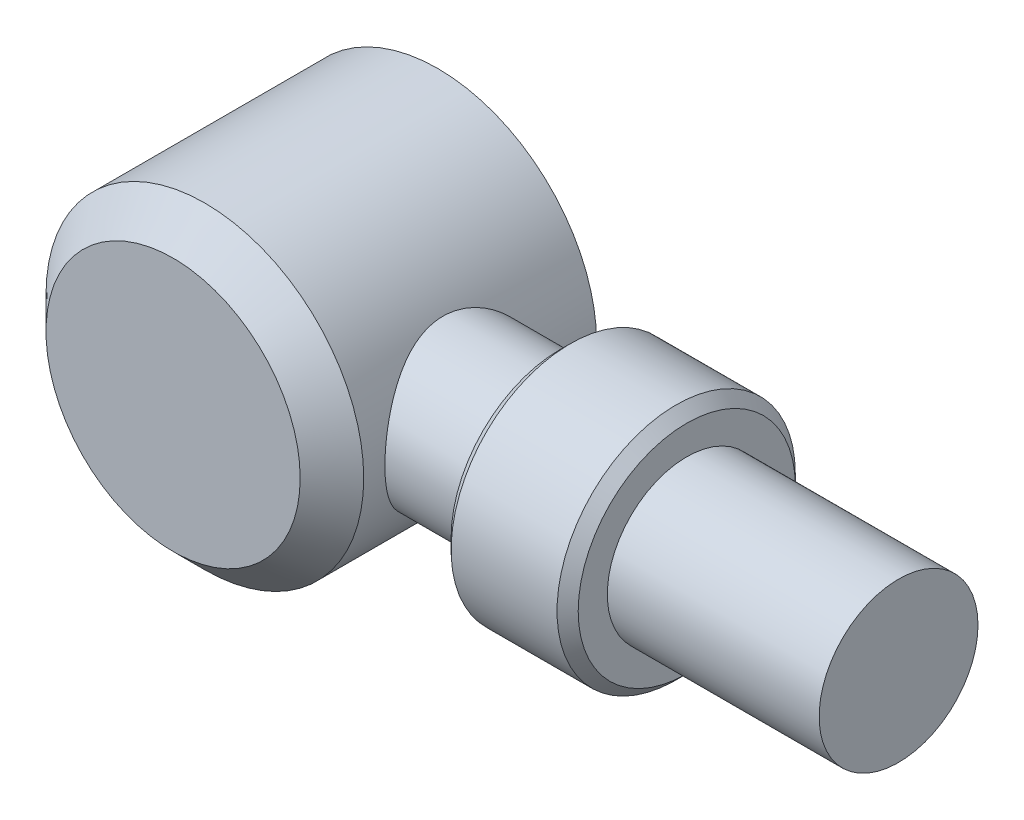
ISO-10303-21;
HEADER;
FILE_DESCRIPTION(('STEP AP214'),'2;1');
FILE_NAME('part.step','',(''),(''),'','','');
FILE_SCHEMA(('AUTOMOTIVE_DESIGN { 1 0 10303 214 1 1 1 1 }'));
ENDSEC;
DATA;
#1=APPLICATION_CONTEXT('core data for automotive mechanical design processes');
#2=APPLICATION_PROTOCOL_DEFINITION('international standard','automotive_design',2000,#1);
#3=PRODUCT_CONTEXT('',#1,'mechanical');
#4=PRODUCT('Part','Part','',(#3));
#5=PRODUCT_RELATED_PRODUCT_CATEGORY('part','',(#4));
#6=PRODUCT_DEFINITION_FORMATION('','',#4);
#7=PRODUCT_DEFINITION_CONTEXT('part definition',#1,'design');
#8=PRODUCT_DEFINITION('design','',#6,#7);
#9=PRODUCT_DEFINITION_SHAPE('','',#8);
#10=(LENGTH_UNIT() NAMED_UNIT(*) SI_UNIT(.MILLI.,.METRE.));
#11=(NAMED_UNIT(*) PLANE_ANGLE_UNIT() SI_UNIT($,.RADIAN.));
#12=(NAMED_UNIT(*) SI_UNIT($,.STERADIAN.) SOLID_ANGLE_UNIT());
#13=UNCERTAINTY_MEASURE_WITH_UNIT(LENGTH_MEASURE(1.E-05),#10,'distance_accuracy_value','');
#14=(GEOMETRIC_REPRESENTATION_CONTEXT(3) GLOBAL_UNCERTAINTY_ASSIGNED_CONTEXT((#13)) GLOBAL_UNIT_ASSIGNED_CONTEXT((#10,
#11,#12)) REPRESENTATION_CONTEXT('',''));
#15=CARTESIAN_POINT('',(0.,0.,0.));
#16=DIRECTION('',(0.,0.,1.));
#17=DIRECTION('',(1.,0.,0.));
#18=AXIS2_PLACEMENT_3D('',#15,#16,#17);
#19=CARTESIAN_POINT('',(-30.002,0.,0.));
#20=DIRECTION('',(1.,0.,0.));
#21=DIRECTION('',(0.,0.,-1.));
#22=AXIS2_PLACEMENT_3D('',#19,#20,#21);
#23=CYLINDRICAL_SURFACE('',#22,15.);
#24=CARTESIAN_POINT('',(30.,0.,-15.));
#25=CARTESIAN_POINT('',(29.999998801557,0.394466621474774,-14.9999986967893));
#26=CARTESIAN_POINT('',(29.9922016255587,0.788960822893599,-14.9844217290986));
#27=CARTESIAN_POINT('',(29.9612093031255,1.57504384672489,-14.9222912626951));
#28=CARTESIAN_POINT('',(29.9380074580889,1.96663133023565,-14.8757242881962));
#29=CARTESIAN_POINT('',(29.8767543344875,2.74444839066597,-14.752062134402));
#30=CARTESIAN_POINT('',(29.8386781124095,3.13066783309048,-14.674915671778));
#31=CARTESIAN_POINT('',(29.7486545172118,3.89427274204148,-14.4909926788045));
#32=CARTESIAN_POINT('',(29.6967085313725,4.27165908796738,-14.3842191117729));
#33=CARTESIAN_POINT('',(29.5804545351662,5.01370255233915,-14.1426464967422));
#34=CARTESIAN_POINT('',(29.5161956713169,5.37840368544458,-14.0079586988167));
#35=CARTESIAN_POINT('',(29.3766988124944,6.09447648128182,-13.7115835174738));
#36=CARTESIAN_POINT('',(29.3014605811394,6.4458478568234,-13.5498955527415));
#37=CARTESIAN_POINT('',(29.1417386091232,7.1332709828304,-13.2009461452605));
#38=CARTESIAN_POINT('',(29.0572582848678,7.4693283295993,-13.0136941461368));
#39=CARTESIAN_POINT('',(28.8808404069853,8.12479620523716,-12.6148696065897));
#40=CARTESIAN_POINT('',(28.7888999175694,8.44420009848105,-12.4032874777652));
#41=CARTESIAN_POINT('',(28.5938305145778,9.08356730455507,-11.9437431549207));
#42=CARTESIAN_POINT('',(28.4903612440417,9.40240338911198,-11.6943566948693));
#43=CARTESIAN_POINT('',(28.279698941058,10.0182110858624,-11.1713323045257));
#44=CARTESIAN_POINT('',(28.172505695949,10.3151814463611,-10.8976929878613));
#45=CARTESIAN_POINT('',(27.9568659465954,10.8860835918351,-10.32744213221));
#46=CARTESIAN_POINT('',(27.8484187026569,11.1600008976787,-10.0308163772597));
#47=CARTESIAN_POINT('',(27.6329515274257,11.6833254232374,-9.41609706949253));
#48=CARTESIAN_POINT('',(27.5259318676454,11.9327280363632,-9.09799950074794));
#49=CARTESIAN_POINT('',(27.3078803121426,12.424066666325,-8.41621019135653));
#50=CARTESIAN_POINT('',(27.1971850469137,12.6639084928374,-8.05089693128161));
#51=CARTESIAN_POINT('',(26.98418857013,13.1116371457317,-7.29906225682783));
#52=CARTESIAN_POINT('',(26.8818838099586,13.319537514021,-6.91254992484985));
#53=CARTESIAN_POINT('',(26.6891822439467,13.7015816677248,-6.12045119528937));
#54=CARTESIAN_POINT('',(26.5987818363898,13.8757356708103,-5.71487061752194));
#55=CARTESIAN_POINT('',(26.4333149346089,14.1884178363296,-4.88717106989482));
#56=CARTESIAN_POINT('',(26.3582467414714,14.3269499463523,-4.46505393858207));
#57=CARTESIAN_POINT('',(26.2305343638818,14.5593818816456,-3.63312743966091));
#58=CARTESIAN_POINT('',(26.1768180083281,14.6554546162323,-3.22409061692207));
#59=CARTESIAN_POINT('',(26.0879066274182,14.8131483158836,-2.39742530260421));
#60=CARTESIAN_POINT('',(26.0527108097854,14.874770754679,-1.97979717934039));
#61=CARTESIAN_POINT('',(26.0023849794443,14.9625716596024,-1.13997809784131));
#62=CARTESIAN_POINT('',(25.9872379945846,14.9887801055065,-0.717791304375868));
#63=CARTESIAN_POINT('',(25.9776389850629,15.0054120092055,0.127503752153189));
#64=CARTESIAN_POINT('',(25.9831849859217,14.9958388811994,0.550611923450824));
#65=CARTESIAN_POINT('',(26.0128145300121,14.9443693637688,1.34318604493255));
#66=CARTESIAN_POINT('',(26.0345983573782,14.9064815133301,1.71300749674339));
#67=CARTESIAN_POINT('',(26.0932327004698,14.8036048078167,2.44761394651885));
#68=CARTESIAN_POINT('',(26.1300818023065,14.7386184959446,2.81239941379462));
#69=CARTESIAN_POINT('',(26.2176501225825,14.5822778462236,3.53465011425935));
#70=CARTESIAN_POINT('',(26.2683728157028,14.490916902454,3.8921134894694));
#71=CARTESIAN_POINT('',(26.3821200845655,14.2827793732036,4.5975509702241));
#72=CARTESIAN_POINT('',(26.4451453155715,14.1660014339124,4.94552456919407));
#73=CARTESIAN_POINT('',(26.5832643427316,13.9051185945145,5.63806138553528));
#74=CARTESIAN_POINT('',(26.6586025203762,13.7604466030275,5.98236177926318));
#75=CARTESIAN_POINT('',(26.8182136501968,13.4467240006948,6.65764881287025));
#76=CARTESIAN_POINT('',(26.902489795027,13.2776646708395,6.98863063670926));
#77=CARTESIAN_POINT('',(27.0778318787809,12.9163207460711,7.63583954119816));
#78=CARTESIAN_POINT('',(27.1688988831368,12.7240325037789,7.95206429387364));
#79=CARTESIAN_POINT('',(27.3556808628563,12.3173373374606,8.56852275615356));
#80=CARTESIAN_POINT('',(27.4513962107378,12.1029286391493,8.86875518007756));
#81=CARTESIAN_POINT('',(27.6577118454254,11.6244221009995,9.48921356105551));
#82=CARTESIAN_POINT('',(27.7686577108201,11.357472454083,9.8071301881341));
#83=CARTESIAN_POINT('',(27.9908280513488,10.7983337273758,10.4195910602954));
#84=CARTESIAN_POINT('',(28.1020524162508,10.5061534517949,10.7141433900476));
#85=CARTESIAN_POINT('',(28.3221096552122,9.89761910582899,11.2787205781467));
#86=CARTESIAN_POINT('',(28.4309403363792,9.58124396820907,11.5487236024523));
#87=CARTESIAN_POINT('',(28.6433515457476,8.92619254193718,12.0621805278786));
#88=CARTESIAN_POINT('',(28.7469341587371,8.58752523371367,12.3056450163623));
#89=CARTESIAN_POINT('',(28.9509720492018,7.87309152384947,12.7751937974681));
#90=CARTESIAN_POINT('',(29.0510540383704,7.49633062281164,12.999931268877));
#91=CARTESIAN_POINT('',(29.2398602306793,6.72229496746224,13.4165538554255));
#92=CARTESIAN_POINT('',(29.3285839048568,6.32501925897373,13.608437440683));
#93=CARTESIAN_POINT('',(29.4920238478019,5.51289034160744,13.9571914545699));
#94=CARTESIAN_POINT('',(29.5667490178724,5.09804850978522,14.1140841452216));
#95=CARTESIAN_POINT('',(29.6999715301343,4.25373396764103,14.391076168471));
#96=CARTESIAN_POINT('',(29.7584707390643,3.82426294674312,14.5111797336915));
#97=CARTESIAN_POINT('',(29.8532869753576,2.99040123124788,14.7045987917793));
#98=CARTESIAN_POINT('',(29.8910400620817,2.58687987737182,14.780965864728));
#99=CARTESIAN_POINT('',(29.9502903820135,1.77375891598893,14.9004227368483));
#100=CARTESIAN_POINT('',(29.9717884994209,1.36415964033065,14.9435143460633));
#101=CARTESIAN_POINT('',(29.997911413823,0.542432179601609,14.9958394822899));
#102=CARTESIAN_POINT('',(30.0025429572167,0.130305071717025,15.0050865466642));
#103=CARTESIAN_POINT('',(29.994817097575,-0.693142933067787,14.9896332143828));
#104=CARTESIAN_POINT('',(29.9824604464011,-1.10446386484085,14.9649343201033));
#105=CARTESIAN_POINT('',(29.9427257003129,-1.89104365716467,14.8851569218173));
#106=CARTESIAN_POINT('',(29.9165882159642,-2.26662317638415,14.8325856924447));
#107=CARTESIAN_POINT('',(29.8508011715185,-3.01155508953995,14.6994449555599));
#108=CARTESIAN_POINT('',(29.8111524808224,-3.38090788254089,14.6188772495211));
#109=CARTESIAN_POINT('',(29.7192676443939,-4.11102643115709,14.4305792041858));
#110=CARTESIAN_POINT('',(29.6670307986078,-4.47179170797617,14.322847354219));
#111=CARTESIAN_POINT('',(29.5511518897374,-5.18257720416892,14.0812572947496));
#112=CARTESIAN_POINT('',(29.4875093474508,-5.53259697135358,13.9473979874992));
#113=CARTESIAN_POINT('',(29.3482462177938,-6.22979935488013,13.6505393721982));
#114=CARTESIAN_POINT('',(29.272335697607,-6.57661612017299,13.4868176517073));
#115=CARTESIAN_POINT('',(29.1116003998498,-7.25508680349726,13.1343016754682));
#116=CARTESIAN_POINT('',(29.0267755439573,-7.5867405882688,12.9455071994249));
#117=CARTESIAN_POINT('',(28.8500141492428,-8.23341158684488,12.5441531585986));
#118=CARTESIAN_POINT('',(28.7580764758464,-8.5484261329624,12.3315897999932));
#119=CARTESIAN_POINT('',(28.5689877148343,-9.16054648853284,11.8839483671783));
#120=CARTESIAN_POINT('',(28.4718346067851,-9.45764526147814,11.6488615394067));
#121=CARTESIAN_POINT('',(28.264658535799,-10.060839107335,11.1333715012893));
#122=CARTESIAN_POINT('',(28.1543078560172,-10.3649587307601,10.8507851186195));
#123=CARTESIAN_POINT('',(27.9325307005895,-10.9485707923032,10.2616154855625));
#124=CARTESIAN_POINT('',(27.8211041773737,-11.2280621358616,9.95503116977258));
#125=CARTESIAN_POINT('',(27.5999727101685,-11.761157874002,9.31919419442996));
#126=CARTESIAN_POINT('',(27.4902688489899,-12.0147464980315,8.98992792709476));
#127=CARTESIAN_POINT('',(27.2756020510062,-12.4944228999317,8.31037887445767));
#128=CARTESIAN_POINT('',(27.1706399310878,-12.7205059505332,7.96009249191951));
#129=CARTESIAN_POINT('',(26.9635854627915,-13.1539172060939,7.22261605950785));
#130=CARTESIAN_POINT('',(26.8618830625115,-13.3597919511091,6.83445930863628));
#131=CARTESIAN_POINT('',(26.6706596125161,-13.737567232961,6.03927850598328));
#132=CARTESIAN_POINT('',(26.5811326373223,-13.9094843147169,5.63226376216401));
#133=CARTESIAN_POINT('',(26.4177119317274,-14.2174151642657,4.80217565091481));
#134=CARTESIAN_POINT('',(26.343805700354,-14.353457663537,4.37911544662186));
#135=CARTESIAN_POINT('',(26.2146840125195,-14.5879514095295,3.51992505793521));
#136=CARTESIAN_POINT('',(26.1594656622327,-14.6864084766722,3.08379690851378));
#137=CARTESIAN_POINT('',(26.0745391304287,-14.8366134509912,2.24471283239244));
#138=CARTESIAN_POINT('',(26.0428909694122,-14.8919378625023,1.84259137531863));
#139=CARTESIAN_POINT('',(25.9982052216003,-14.9698153891526,1.03415900372212));
#140=CARTESIAN_POINT('',(25.9851663691362,-14.9923707330054,0.627848376009441));
#141=CARTESIAN_POINT('',(25.9782426346808,-15.0043645010929,-0.185270351507959));
#142=CARTESIAN_POINT('',(25.9843506681547,-14.9938151743778,-0.592078211651143));
#143=CARTESIAN_POINT('',(26.0154509876885,-14.9397884815991,-1.4027581646797));
#144=CARTESIAN_POINT('',(26.0404425006674,-14.8963124635393,-1.80663037706581));
#145=CARTESIAN_POINT('',(26.1050327210138,-14.782795841076,-2.56967168244059));
#146=CARTESIAN_POINT('',(26.1430058498993,-14.7156934571528,-2.92942204471816));
#147=CARTESIAN_POINT('',(26.2323533322958,-14.5558242789108,-3.64159381579528));
#148=CARTESIAN_POINT('',(26.2837321187293,-14.4630489945772,-3.99401275857394));
#149=CARTESIAN_POINT('',(26.398348288616,-14.2527724980854,-4.68939648000359));
#150=CARTESIAN_POINT('',(26.4615858132274,-14.1352709916016,-5.03236114606177));
#151=CARTESIAN_POINT('',(26.5981673635335,-13.8765585244577,-5.70716431681699));
#152=CARTESIAN_POINT('',(26.6715123835342,-13.7353452308956,-6.03900172289249));
#153=CARTESIAN_POINT('',(26.8316304555799,-13.4200195538922,-6.71194905721807));
#154=CARTESIAN_POINT('',(26.9189743770845,-13.2443351386714,-7.05218633738285));
#155=CARTESIAN_POINT('',(27.1006892572676,-12.8684192321828,-7.71683729888765));
#156=CARTESIAN_POINT('',(27.195060430022,-12.6681869929773,-8.04125049766907));
#157=CARTESIAN_POINT('',(27.3885333524453,-12.2442855818538,-8.67307599887718));
#158=CARTESIAN_POINT('',(27.4876368748118,-12.0206075892618,-8.9804818359264));
#159=CARTESIAN_POINT('',(27.6882651807261,-11.5509819278367,-9.57700095794095));
#160=CARTESIAN_POINT('',(27.7897903252146,-11.3050309237573,-9.86611149224955));
#161=CARTESIAN_POINT('',(28.0054119834236,-10.7607009160988,-10.4588881043877));
#162=CARTESIAN_POINT('',(28.1195336241787,-10.4595848725634,-10.7600384098886));
#163=CARTESIAN_POINT('',(28.3449371560153,-9.83237263592982,-11.3360350079752));
#164=CARTESIAN_POINT('',(28.4562199211215,-9.50628425805797,-11.6108894699081));
#165=CARTESIAN_POINT('',(28.673159445471,-8.83040064495089,-12.1328673274452));
#166=CARTESIAN_POINT('',(28.778811692232,-8.48058689086184,-12.3799686513199));
#167=CARTESIAN_POINT('',(28.9815957867285,-7.75934315416603,-12.8443186951047));
#168=CARTESIAN_POINT('',(29.0787281252935,-7.38791441884538,-13.0615691351246));
#169=CARTESIAN_POINT('',(29.2625004136629,-6.62283359834586,-13.4657554418474));
#170=CARTESIAN_POINT('',(29.3490603255149,-6.22904153096555,-13.652463307469));
#171=CARTESIAN_POINT('',(29.5084068974344,-5.42422205013372,-13.9917304392215));
#172=CARTESIAN_POINT('',(29.581191583951,-5.01319217734311,-14.1442848128173));
#173=CARTESIAN_POINT('',(29.7106316368391,-4.17809175418139,-14.4130312534336));
#174=CARTESIAN_POINT('',(29.7673271650683,-3.75405665560563,-14.52931393542));
#175=CARTESIAN_POINT('',(29.8630393092051,-2.8957098332815,-14.7244141315277));
#176=CARTESIAN_POINT('',(29.9020667236411,-2.46140455781256,-14.8032545313493));
#177=CARTESIAN_POINT('',(29.9542914994303,-1.68912528485809,-14.9084233559045));
#178=CARTESIAN_POINT('',(29.9714022130442,-1.35247752005867,-14.9427351996439));
#179=CARTESIAN_POINT('',(29.9942571345872,-0.67722664728,-14.9885243961843));
#180=CARTESIAN_POINT('',(30.000001028784,-0.338623485589113,-15.0000011187201));
#181=CARTESIAN_POINT('',(30.,0.,-15.));
#182=B_SPLINE_CURVE_WITH_KNOTS('',3,(#24,#25,#26,#27,#28,#29,#30,#31,#32,#33,#34,#35,#36,#37,
#38,#39,#40,#41,#42,#43,#44,#45,#46,#47,#48,#49,#50,#51,#52,#53,#54,#55,#56,#57,#58,#59,#60,#61,
#62,#63,#64,#65,#66,#67,#68,#69,#70,#71,#72,#73,#74,#75,#76,#77,#78,#79,#80,#81,#82,#83,#84,#85,
#86,#87,#88,#89,#90,#91,#92,#93,#94,#95,#96,#97,#98,#99,#100,#101,#102,#103,#104,#105,#106,#107,
#108,#109,#110,#111,#112,#113,#114,#115,#116,#117,#118,#119,#120,#121,#122,#123,#124,#125,#126,
#127,#128,#129,#130,#131,#132,#133,#134,#135,#136,#137,#138,#139,#140,#141,#142,#143,#144,#145,
#146,#147,#148,#149,#150,#151,#152,#153,#154,#155,#156,#157,#158,#159,#160,#161,#162,#163,#164,
#165,#166,#167,#168,#169,#170,#171,#172,#173,#174,#175,#176,#177,#178,#179,#180,#181),
.UNSPECIFIED.,.T.,.F.,(4,2,2,2,2,2,2,2,2,2,2,2,2,2,2,2,2,2,2,2,2,2,2,2,2,2,2,2,2,2,2,2,2,2,2,2,
2,2,2,2,2,2,2,2,2,2,2,2,2,2,2,2,2,2,2,2,2,2,2,2,2,2,2,2,2,2,2,2,2,2,2,2,2,2,2,2,2,2,4),(0.,
1.1830658838765,2.36664655205927,3.5522205995842,4.73767610811697,5.91849492154762,
7.09933916134023,8.27974835920213,9.46062435602729,10.7126941080732,11.9648354787242,
13.2177575130875,14.4709145374423,15.821667201721,17.1718456109054,18.5216145742371,
19.8712338927467,21.1401798733571,22.4090715662491,23.6768884023223,24.9445842691984,
26.0604534443427,27.1762179182402,28.2922620948529,29.4083657309785,30.5501573825651,
31.6923582661888,32.8347387306653,33.9772108970053,35.2649000045823,36.5521415758273,
37.8405170382692,39.1283766165387,40.4765138704575,41.824713885002,43.1720536807209,
44.519238405488,45.7548292237563,46.9903528264139,48.2253821822107,49.4603568799793,
50.5994583371909,51.7384865108584,52.8775780428886,54.0167174442702,55.188356729037,
56.3600063087793,57.53184316668,58.7041373111917,59.9914055352965,61.2787309408958,
62.5668355046821,63.8551611378706,65.2063513889893,66.5568816778176,67.9063270370394,
69.2555633384069,70.4752824018563,71.6949185050053,72.9141033841497,74.1332383531127,
75.2357784731186,76.3386836391977,77.4416019343193,78.5446288045349,79.7216927437009,
80.8987925552604,82.0763368112874,83.2540576898124,84.5752168212047,85.895964165236,
87.217754555028,88.5394687467831,89.8706389488176,91.2019997209938,92.5300073067729,
93.8572021316087,94.872757858524,95.8883416150966),.UNSPECIFIED.);
#183=CARTESIAN_POINT('',(30.,0.,-15.));
#184=VERTEX_POINT('',#183);
#185=EDGE_CURVE('E74',#184,#184,#182,.T.);
#186=ORIENTED_EDGE('',*,*,#185,.T.);
#187=EDGE_LOOP('',(#186));
#188=FACE_BOUND('',#187,.T.);
#189=CARTESIAN_POINT('',(48.,0.,0.));
#190=DIRECTION('',(1.,0.,0.));
#191=DIRECTION('',(0.,0.,-1.));
#192=AXIS2_PLACEMENT_3D('',#189,#190,#191);
#193=CIRCLE('',#192,15.);
#194=CARTESIAN_POINT('',(48.,0.,-15.));
#195=VERTEX_POINT('',#194);
#196=EDGE_CURVE('E58',#195,#195,#193,.F.);
#197=ORIENTED_EDGE('',*,*,#196,.T.);
#198=EDGE_LOOP('',(#197));
#199=FACE_BOUND('',#198,.T.);
#200=ADVANCED_FACE('F36',(#188,#199),#23,.T.);
#201=CARTESIAN_POINT('',(0.,0.,25.));
#202=DIRECTION('',(0.,0.,-1.));
#203=DIRECTION('',(-1.,0.,0.));
#204=AXIS2_PLACEMENT_3D('',#201,#202,#203);
#205=CYLINDRICAL_SURFACE('',#204,30.);
#206=ORIENTED_EDGE('',*,*,#185,.F.);
#207=EDGE_LOOP('',(#206));
#208=FACE_BOUND('',#207,.T.);
#209=CARTESIAN_POINT('',(0.,0.,18.9999999999999));
#210=DIRECTION('',(0.,0.,1.));
#211=DIRECTION('',(1.,0.,0.));
#212=AXIS2_PLACEMENT_3D('',#209,#210,#211);
#213=CIRCLE('',#212,30.);
#214=CARTESIAN_POINT('',(30.,0.,18.9999999999999));
#215=VERTEX_POINT('',#214);
#216=EDGE_CURVE('E65',#215,#215,#213,.F.);
#217=ORIENTED_EDGE('',*,*,#216,.T.);
#218=EDGE_LOOP('',(#217));
#219=FACE_BOUND('',#218,.T.);
#220=CARTESIAN_POINT('',(0.,0.,-25.));
#221=DIRECTION('',(0.,0.,1.));
#222=DIRECTION('',(1.,0.,0.));
#223=AXIS2_PLACEMENT_3D('',#220,#221,#222);
#224=CIRCLE('',#223,30.);
#225=CARTESIAN_POINT('',(30.,0.,-25.));
#226=VERTEX_POINT('',#225);
#227=EDGE_CURVE('E71',#226,#226,#224,.T.);
#228=ORIENTED_EDGE('',*,*,#227,.T.);
#229=EDGE_LOOP('',(#228));
#230=FACE_BOUND('',#229,.T.);
#231=ADVANCED_FACE('F92',(#208,#219,#230),#205,.T.);
#232=CARTESIAN_POINT('',(0.,0.,25.));
#233=DIRECTION('',(0.,0.,1.));
#234=DIRECTION('',(1.,0.,0.));
#235=AXIS2_PLACEMENT_3D('',#232,#233,#234);
#236=PLANE('',#235);
#237=CARTESIAN_POINT('',(0.,0.,25.));
#238=DIRECTION('',(0.,0.,1.));
#239=DIRECTION('',(1.,0.,0.));
#240=AXIS2_PLACEMENT_3D('',#237,#238,#239);
#241=CIRCLE('',#240,24.);
#242=CARTESIAN_POINT('',(24.,0.,25.));
#243=VERTEX_POINT('',#242);
#244=EDGE_CURVE('E68',#243,#243,#241,.T.);
#245=ORIENTED_EDGE('',*,*,#244,.T.);
#246=EDGE_LOOP('',(#245));
#247=FACE_BOUND('',#246,.T.);
#248=ADVANCED_FACE('F88',(#247),#236,.T.);
#249=CARTESIAN_POINT('',(0.,0.,-25.));
#250=DIRECTION('',(0.,0.,1.));
#251=DIRECTION('',(1.,0.,0.));
#252=AXIS2_PLACEMENT_3D('',#249,#250,#251);
#253=PLANE('',#252);
#254=CARTESIAN_POINT('',(0.,0.,-25.));
#255=DIRECTION('',(0.,0.,-1.));
#256=DIRECTION('',(-1.,0.,0.));
#257=AXIS2_PLACEMENT_3D('',#254,#255,#256);
#258=CIRCLE('',#257,15.);
#259=CARTESIAN_POINT('',(-15.,0.,-25.));
#260=VERTEX_POINT('',#259);
#261=EDGE_CURVE('E214',#260,#260,#258,.T.);
#262=ORIENTED_EDGE('',*,*,#261,.F.);
#263=EDGE_LOOP('',(#262));
#264=FACE_BOUND('',#263,.T.);
#265=ORIENTED_EDGE('',*,*,#227,.F.);
#266=EDGE_LOOP('',(#265));
#267=FACE_BOUND('',#266,.T.);
#268=ADVANCED_FACE('F91',(#264,#267),#253,.F.);
#269=CARTESIAN_POINT('',(0.,0.,25.));
#270=DIRECTION('',(0.,0.,-1.));
#271=DIRECTION('',(-1.,0.,0.));
#272=AXIS2_PLACEMENT_3D('',#269,#270,#271);
#273=CONICAL_SURFACE('',#272,24.,0.785398163397446);
#274=ORIENTED_EDGE('',*,*,#216,.F.);
#275=EDGE_LOOP('',(#274));
#276=FACE_BOUND('',#275,.T.);
#277=ORIENTED_EDGE('',*,*,#244,.F.);
#278=EDGE_LOOP('',(#277));
#279=FACE_BOUND('',#278,.T.);
#280=ADVANCED_FACE('F96',(#276,#279),#273,.T.);
#281=CARTESIAN_POINT('',(48.,0.,0.));
#282=DIRECTION('',(1.,0.,0.));
#283=DIRECTION('',(0.,0.,-1.));
#284=AXIS2_PLACEMENT_3D('',#281,#282,#283);
#285=CYLINDRICAL_SURFACE('',#284,22.5);
#286=CARTESIAN_POINT('',(50.,0.,0.));
#287=DIRECTION('',(1.,0.,0.));
#288=DIRECTION('',(0.,0.,-1.));
#289=AXIS2_PLACEMENT_3D('',#286,#287,#288);
#290=CIRCLE('',#289,22.5);
#291=CARTESIAN_POINT('',(50.,0.,-22.5));
#292=VERTEX_POINT('',#291);
#293=EDGE_CURVE('E48',#292,#292,#290,.T.);
#294=ORIENTED_EDGE('',*,*,#293,.T.);
#295=EDGE_LOOP('',(#294));
#296=FACE_BOUND('',#295,.T.);
#297=CARTESIAN_POINT('',(70.,0.,0.));
#298=DIRECTION('',(1.,0.,0.));
#299=DIRECTION('',(0.,0.,-1.));
#300=AXIS2_PLACEMENT_3D('',#297,#298,#299);
#301=CIRCLE('',#300,22.5);
#302=CARTESIAN_POINT('',(70.,0.,-22.5));
#303=VERTEX_POINT('',#302);
#304=EDGE_CURVE('E52',#303,#303,#301,.F.);
#305=ORIENTED_EDGE('',*,*,#304,.T.);
#306=EDGE_LOOP('',(#305));
#307=FACE_BOUND('',#306,.T.);
#308=ADVANCED_FACE('F106',(#296,#307),#285,.T.);
#309=CARTESIAN_POINT('',(48.,0.,0.));
#310=DIRECTION('',(1.,0.,0.));
#311=DIRECTION('',(0.,0.,-1.));
#312=AXIS2_PLACEMENT_3D('',#309,#310,#311);
#313=PLANE('',#312);
#314=CARTESIAN_POINT('',(48.,0.,0.));
#315=DIRECTION('',(1.,0.,0.));
#316=DIRECTION('',(0.,0.,-1.));
#317=AXIS2_PLACEMENT_3D('',#314,#315,#316);
#318=CIRCLE('',#317,20.5);
#319=CARTESIAN_POINT('',(48.,0.,-20.5));
#320=VERTEX_POINT('',#319);
#321=EDGE_CURVE('E44',#320,#320,#318,.F.);
#322=ORIENTED_EDGE('',*,*,#321,.T.);
#323=EDGE_LOOP('',(#322));
#324=FACE_BOUND('',#323,.T.);
#325=ORIENTED_EDGE('',*,*,#196,.F.);
#326=EDGE_LOOP('',(#325));
#327=FACE_BOUND('',#326,.T.);
#328=ADVANCED_FACE('F130',(#324,#327),#313,.F.);
#329=CARTESIAN_POINT('',(72.,0.,0.));
#330=DIRECTION('',(1.,0.,0.));
#331=DIRECTION('',(0.,0.,-1.));
#332=AXIS2_PLACEMENT_3D('',#329,#330,#331);
#333=PLANE('',#332);
#334=CARTESIAN_POINT('',(72.,0.,0.));
#335=DIRECTION('',(1.,0.,0.));
#336=DIRECTION('',(0.,0.,-1.));
#337=AXIS2_PLACEMENT_3D('',#334,#335,#336);
#338=CIRCLE('',#337,20.5);
#339=CARTESIAN_POINT('',(72.,0.,-20.5));
#340=VERTEX_POINT('',#339);
#341=EDGE_CURVE('E10',#340,#340,#338,.T.);
#342=ORIENTED_EDGE('',*,*,#341,.T.);
#343=EDGE_LOOP('',(#342));
#344=FACE_BOUND('',#343,.T.);
#345=CARTESIAN_POINT('',(72.,0.,0.));
#346=DIRECTION('',(1.,0.,0.));
#347=DIRECTION('',(0.,0.,-1.));
#348=AXIS2_PLACEMENT_3D('',#345,#346,#347);
#349=CIRCLE('',#348,15.);
#350=CARTESIAN_POINT('',(72.,0.,-15.));
#351=VERTEX_POINT('',#350);
#352=EDGE_CURVE('E57',#351,#351,#349,.F.);
#353=ORIENTED_EDGE('',*,*,#352,.T.);
#354=EDGE_LOOP('',(#353));
#355=FACE_BOUND('',#354,.T.);
#356=ADVANCED_FACE('F132',(#344,#355),#333,.T.);
#357=CARTESIAN_POINT('',(112.,0.,0.));
#358=DIRECTION('',(1.,0.,0.));
#359=DIRECTION('',(0.,0.,-1.));
#360=AXIS2_PLACEMENT_3D('',#357,#358,#359);
#361=PLANE('',#360);
#362=CARTESIAN_POINT('',(112.,0.,0.));
#363=DIRECTION('',(1.,0.,0.));
#364=DIRECTION('',(0.,0.,-1.));
#365=AXIS2_PLACEMENT_3D('',#362,#363,#364);
#366=CIRCLE('',#365,15.);
#367=CARTESIAN_POINT('',(112.,0.,-15.));
#368=VERTEX_POINT('',#367);
#369=EDGE_CURVE('E61',#368,#368,#366,.T.);
#370=ORIENTED_EDGE('',*,*,#369,.T.);
#371=EDGE_LOOP('',(#370));
#372=FACE_BOUND('',#371,.T.);
#373=ADVANCED_FACE('F119',(#372),#361,.T.);
#374=ORIENTED_EDGE('',*,*,#352,.F.);
#375=EDGE_LOOP('',(#374));
#376=FACE_BOUND('',#375,.T.);
#377=ORIENTED_EDGE('',*,*,#369,.F.);
#378=EDGE_LOOP('',(#377));
#379=FACE_BOUND('',#378,.T.);
#380=ADVANCED_FACE('F83',(#376,#379),#23,.T.);
#381=CARTESIAN_POINT('',(50.,0.,0.));
#382=DIRECTION('',(1.,0.,0.));
#383=DIRECTION('',(0.,0.,-1.));
#384=AXIS2_PLACEMENT_3D('',#381,#382,#383);
#385=CONICAL_SURFACE('',#384,22.5,0.785398163397448);
#386=ORIENTED_EDGE('',*,*,#321,.F.);
#387=EDGE_LOOP('',(#386));
#388=FACE_BOUND('',#387,.T.);
#389=ORIENTED_EDGE('',*,*,#293,.F.);
#390=EDGE_LOOP('',(#389));
#391=FACE_BOUND('',#390,.T.);
#392=ADVANCED_FACE('F108',(#388,#391),#385,.T.);
#393=CARTESIAN_POINT('',(72.,0.,0.));
#394=DIRECTION('',(-1.,0.,0.));
#395=DIRECTION('',(0.,0.,1.));
#396=AXIS2_PLACEMENT_3D('',#393,#394,#395);
#397=CONICAL_SURFACE('',#396,20.5,0.785398163397444);
#398=ORIENTED_EDGE('',*,*,#304,.F.);
#399=EDGE_LOOP('',(#398));
#400=FACE_BOUND('',#399,.T.);
#401=ORIENTED_EDGE('',*,*,#341,.F.);
#402=EDGE_LOOP('',(#401));
#403=FACE_BOUND('',#402,.T.);
#404=ADVANCED_FACE('F39',(#400,#403),#397,.T.);
#405=CARTESIAN_POINT('',(0.,0.,-15.));
#406=DIRECTION('',(0.,0.,-1.));
#407=DIRECTION('',(-1.,0.,0.));
#408=AXIS2_PLACEMENT_3D('',#405,#406,#407);
#409=CYLINDRICAL_SURFACE('',#408,15.);
#410=CARTESIAN_POINT('',(0.,0.,-15.));
#411=DIRECTION('',(0.,0.,-1.));
#412=DIRECTION('',(-1.,0.,0.));
#413=AXIS2_PLACEMENT_3D('',#410,#411,#412);
#414=CIRCLE('',#413,15.);
#415=CARTESIAN_POINT('',(-15.,0.,-15.));
#416=VERTEX_POINT('',#415);
#417=EDGE_CURVE('E62',#416,#416,#414,.T.);
#418=ORIENTED_EDGE('',*,*,#417,.F.);
#419=EDGE_LOOP('',(#418));
#420=FACE_BOUND('',#419,.T.);
#421=ORIENTED_EDGE('',*,*,#261,.T.);
#422=EDGE_LOOP('',(#421));
#423=FACE_BOUND('',#422,.T.);
#424=ADVANCED_FACE('F117',(#420,#423),#409,.F.);
#425=CARTESIAN_POINT('',(0.,0.,-15.));
#426=DIRECTION('',(0.,0.,-1.));
#427=DIRECTION('',(-1.,0.,0.));
#428=AXIS2_PLACEMENT_3D('',#425,#426,#427);
#429=PLANE('',#428);
#430=ORIENTED_EDGE('',*,*,#417,.T.);
#431=EDGE_LOOP('',(#430));
#432=FACE_BOUND('',#431,.T.);
#433=ADVANCED_FACE('F200',(#432),#429,.T.);
#434=CLOSED_SHELL('',(#200,#231,#248,#268,#280,#308,#328,#356,#373,#380,#392,#404,#424,#433));
#435=MANIFOLD_SOLID_BREP('B2',#434);
#436=ADVANCED_BREP_SHAPE_REPRESENTATION('',(#18,#435),#14);
#437=SHAPE_DEFINITION_REPRESENTATION(#9,#436);
ENDSEC;
END-ISO-10303-21;
